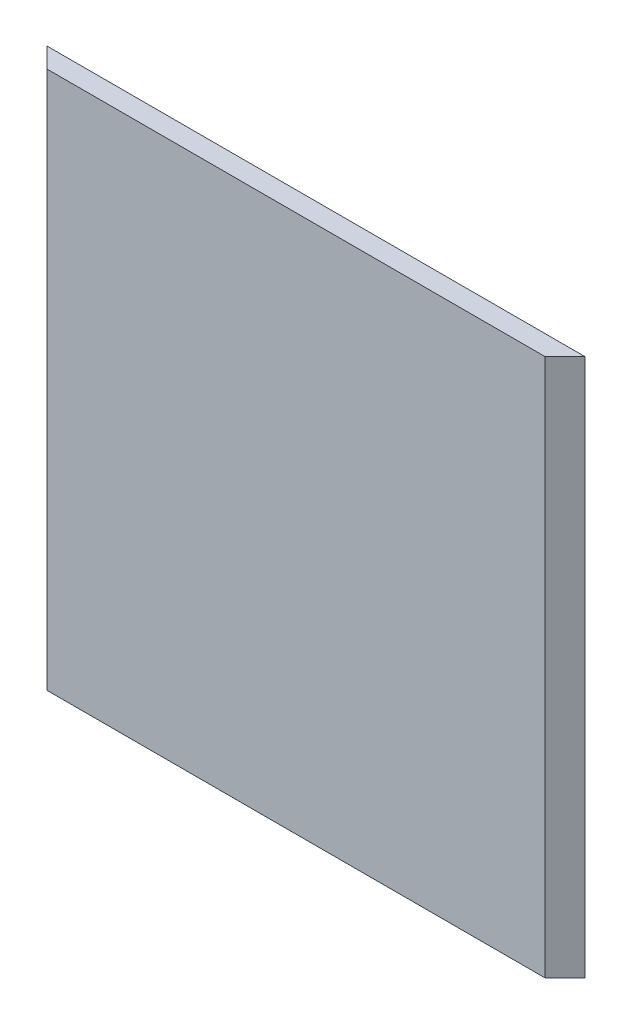
ISO-10303-21;
HEADER;
FILE_DESCRIPTION(('STEP AP214'),'2;1');
FILE_NAME('part.step','',(''),(''),'','','');
FILE_SCHEMA(('AUTOMOTIVE_DESIGN { 1 0 10303 214 1 1 1 1 }'));
ENDSEC;
DATA;
#1=APPLICATION_CONTEXT('core data for automotive mechanical design processes');
#2=APPLICATION_PROTOCOL_DEFINITION('international standard','automotive_design',2000,#1);
#3=PRODUCT_CONTEXT('',#1,'mechanical');
#4=PRODUCT('Part','Part','',(#3));
#5=PRODUCT_RELATED_PRODUCT_CATEGORY('part','',(#4));
#6=PRODUCT_DEFINITION_FORMATION('','',#4);
#7=PRODUCT_DEFINITION_CONTEXT('part definition',#1,'design');
#8=PRODUCT_DEFINITION('design','',#6,#7);
#9=PRODUCT_DEFINITION_SHAPE('','',#8);
#10=(LENGTH_UNIT() NAMED_UNIT(*) SI_UNIT(.MILLI.,.METRE.));
#11=(NAMED_UNIT(*) PLANE_ANGLE_UNIT() SI_UNIT($,.RADIAN.));
#12=(NAMED_UNIT(*) SI_UNIT($,.STERADIAN.) SOLID_ANGLE_UNIT());
#13=UNCERTAINTY_MEASURE_WITH_UNIT(LENGTH_MEASURE(1.E-05),#10,'distance_accuracy_value','');
#14=(GEOMETRIC_REPRESENTATION_CONTEXT(3) GLOBAL_UNCERTAINTY_ASSIGNED_CONTEXT((#13)) GLOBAL_UNIT_ASSIGNED_CONTEXT((#10,
#11,#12)) REPRESENTATION_CONTEXT('',''));
#15=CARTESIAN_POINT('',(0.,0.,0.));
#16=DIRECTION('',(0.,0.,1.));
#17=DIRECTION('',(1.,0.,0.));
#18=AXIS2_PLACEMENT_3D('',#15,#16,#17);
#19=CARTESIAN_POINT('',(62.50000122,59.0000006,1.));
#20=DIRECTION('',(0.,0.,1.));
#21=DIRECTION('',(1.,0.,0.));
#22=AXIS2_PLACEMENT_3D('',#19,#20,#21);
#23=PLANE('',#22);
#24=DIRECTION('',(1.,1.19248806385E-08,0.));
#25=VECTOR('',#24,1.);
#26=CARTESIAN_POINT('',(63.265788701307,58.325000609132,1.));
#27=LINE('',#26,#25);
#28=CARTESIAN_POINT('',(63.1250012240247,58.3250006037265,1.00000000402467));
#29=VERTEX_POINT('',#28);
#30=CARTESIAN_POINT('',(61.8750012240245,58.325000592249,1.00000000000002));
#31=VERTEX_POINT('',#30);
#32=EDGE_CURVE('E81',#29,#31,#27,.F.);
#33=ORIENTED_EDGE('',*,*,#32,.F.);
#34=DIRECTION('',(-5.96244031924794E-09,1.,-5.96244031924794E-09));
#35=VECTOR('',#34,1.);
#36=CARTESIAN_POINT('',(63.1250012191805,58.462500607751,1.0000000072295));
#37=LINE('',#36,#35);
#38=CARTESIAN_POINT('',(63.1250012159755,59.675000607602,1.00000000000001));
#39=VERTEX_POINT('',#38);
#40=EDGE_CURVE('E68',#39,#29,#37,.F.);
#41=ORIENTED_EDGE('',*,*,#40,.F.);
#42=DIRECTION('',(-1.,-1.19248806385E-08,0.));
#43=VECTOR('',#42,1.);
#44=CARTESIAN_POINT('',(61.734213738693,59.675000590868,1.));
#45=LINE('',#44,#43);
#46=CARTESIAN_POINT('',(61.8750012159753,59.6750005962735,1.00000000402467));
#47=VERTEX_POINT('',#46);
#48=EDGE_CURVE('E55',#47,#39,#45,.F.);
#49=ORIENTED_EDGE('',*,*,#48,.F.);
#50=DIRECTION('',(-5.96244031924794E-09,1.,5.96244031924794E-09));
#51=VECTOR('',#50,1.);
#52=CARTESIAN_POINT('',(61.8750012208195,59.537500592249,1.0000000072295));
#53=LINE('',#52,#51);
#54=EDGE_CURVE('E20',#31,#47,#53,.T.);
#55=ORIENTED_EDGE('',*,*,#54,.F.);
#56=EDGE_LOOP('',(#33,#41,#49,#55));
#57=FACE_BOUND('',#56,.T.);
#58=ADVANCED_FACE('F17',(#57),#23,.T.);
#59=CARTESIAN_POINT('',(61.85000121359,59.537500592249,0.975));
#60=DIRECTION('',(-0.707106781186548,-8.4321639643206E-09,0.707106781186548));
#61=DIRECTION('',(0.707106781186548,0.,0.707106781186548));
#62=AXIS2_PLACEMENT_3D('',#59,#60,#61);
#63=PLANE('',#62);
#64=DIRECTION('',(-0.707106781186557,-8.43218154936109E-09,-0.707106781186538));
#65=VECTOR('',#64,1.);
#66=CARTESIAN_POINT('',(61.875001228049,58.325000592547,1.));
#67=LINE('',#66,#65);
#68=CARTESIAN_POINT('',(61.8250012240245,58.3250005959754,0.949999995975519));
#69=VERTEX_POINT('',#68);
#70=EDGE_CURVE('E64',#31,#69,#67,.T.);
#71=ORIENTED_EDGE('',*,*,#70,.F.);
#72=ORIENTED_EDGE('',*,*,#54,.T.);
#73=DIRECTION('',(0.707106781186607,8.4321815493605E-09,0.707106781186488));
#74=VECTOR('',#73,1.);
#75=CARTESIAN_POINT('',(61.825001211951,59.6750005919506,0.95));
#76=LINE('',#75,#74);
#77=CARTESIAN_POINT('',(61.8250012159753,59.6750005922489,0.950000000000167));
#78=VERTEX_POINT('',#77);
#79=EDGE_CURVE('E61',#78,#47,#76,.T.);
#80=ORIENTED_EDGE('',*,*,#79,.F.);
#81=DIRECTION('',(0.,1.,0.));
#82=VECTOR('',#81,1.);
#83=CARTESIAN_POINT('',(61.825001228049,59.0000006,0.95));
#84=LINE('',#83,#82);
#85=EDGE_CURVE('E83',#69,#78,#84,.T.);
#86=ORIENTED_EDGE('',*,*,#85,.F.);
#87=EDGE_LOOP('',(#71,#72,#80,#86));
#88=FACE_BOUND('',#87,.T.);
#89=ADVANCED_FACE('F60',(#88),#63,.T.);
#90=CARTESIAN_POINT('',(61.734213738693,59.675000590868,1.));
#91=DIRECTION('',(-1.19248806385E-08,1.,0.));
#92=DIRECTION('',(-1.,-1.19248806385E-08,0.));
#93=AXIS2_PLACEMENT_3D('',#90,#91,#92);
#94=PLANE('',#93);
#95=DIRECTION('',(0.707106781186548,0.,-0.707106781186548));
#96=VECTOR('',#95,1.);
#97=CARTESIAN_POINT('',(63.1500012191805,59.675000608049,0.974999992770541));
#98=LINE('',#97,#96);
#99=CARTESIAN_POINT('',(63.1750012139633,59.6750006040246,0.94999999798776));
#100=VERTEX_POINT('',#99);
#101=EDGE_CURVE('E70',#100,#39,#98,.F.);
#102=ORIENTED_EDGE('',*,*,#101,.F.);
#103=DIRECTION('',(-1.,0.,0.));
#104=VECTOR('',#103,1.);
#105=CARTESIAN_POINT('',(62.50000122,59.675000591951,0.95));
#106=LINE('',#105,#104);
#107=EDGE_CURVE('E74',#78,#100,#106,.F.);
#108=ORIENTED_EDGE('',*,*,#107,.F.);
#109=ORIENTED_EDGE('',*,*,#79,.T.);
#110=ORIENTED_EDGE('',*,*,#48,.T.);
#111=EDGE_LOOP('',(#102,#108,#109,#110));
#112=FACE_BOUND('',#111,.T.);
#113=ADVANCED_FACE('F72',(#112),#94,.T.);
#114=CARTESIAN_POINT('',(63.15000122641,58.462500607751,0.975));
#115=DIRECTION('',(0.707106781186548,8.4321639643206E-09,0.707106781186548));
#116=DIRECTION('',(0.707106781186548,0.,-0.707106781186548));
#117=AXIS2_PLACEMENT_3D('',#114,#115,#116);
#118=PLANE('',#117);
#119=DIRECTION('',(-0.707106781186607,-8.4321815493605E-09,0.707106781186488));
#120=VECTOR('',#119,1.);
#121=CARTESIAN_POINT('',(63.175001228049,58.3250006080494,0.95));
#122=LINE('',#121,#120);
#123=CARTESIAN_POINT('',(63.1750012240247,58.3250006077511,0.950000000000165));
#124=VERTEX_POINT('',#123);
#125=EDGE_CURVE('E35',#124,#29,#122,.T.);
#126=ORIENTED_EDGE('',*,*,#125,.F.);
#127=DIRECTION('',(0.,1.,0.));
#128=VECTOR('',#127,1.);
#129=CARTESIAN_POINT('',(63.175001211951,59.0000006,0.95));
#130=LINE('',#129,#128);
#131=EDGE_CURVE('E26',#100,#124,#130,.F.);
#132=ORIENTED_EDGE('',*,*,#131,.F.);
#133=ORIENTED_EDGE('',*,*,#101,.T.);
#134=ORIENTED_EDGE('',*,*,#40,.T.);
#135=EDGE_LOOP('',(#126,#132,#133,#134));
#136=FACE_BOUND('',#135,.T.);
#137=ADVANCED_FACE('F89',(#136),#118,.T.);
#138=CARTESIAN_POINT('',(63.265788701307,58.325000609132,1.));
#139=DIRECTION('',(1.19248806385E-08,-1.,0.));
#140=DIRECTION('',(1.,1.19248806385E-08,0.));
#141=AXIS2_PLACEMENT_3D('',#138,#139,#140);
#142=PLANE('',#141);
#143=ORIENTED_EDGE('',*,*,#125,.T.);
#144=ORIENTED_EDGE('',*,*,#32,.T.);
#145=ORIENTED_EDGE('',*,*,#70,.T.);
#146=DIRECTION('',(-1.,0.,0.));
#147=VECTOR('',#146,1.);
#148=CARTESIAN_POINT('',(62.50000122,58.325000608049,0.95));
#149=LINE('',#148,#147);
#150=EDGE_CURVE('E11',#124,#69,#149,.T.);
#151=ORIENTED_EDGE('',*,*,#150,.F.);
#152=EDGE_LOOP('',(#143,#144,#145,#151));
#153=FACE_BOUND('',#152,.T.);
#154=ADVANCED_FACE('F91',(#153),#142,.T.);
#155=CARTESIAN_POINT('',(62.50000122,59.0000006,0.95));
#156=DIRECTION('',(0.,0.,-1.));
#157=DIRECTION('',(-1.,0.,0.));
#158=AXIS2_PLACEMENT_3D('',#155,#156,#157);
#159=PLANE('',#158);
#160=ORIENTED_EDGE('',*,*,#131,.T.);
#161=ORIENTED_EDGE('',*,*,#150,.T.);
#162=ORIENTED_EDGE('',*,*,#85,.T.);
#163=ORIENTED_EDGE('',*,*,#107,.T.);
#164=EDGE_LOOP('',(#160,#161,#162,#163));
#165=FACE_BOUND('',#164,.T.);
#166=ADVANCED_FACE('F88',(#165),#159,.T.);
#167=CLOSED_SHELL('',(#58,#89,#113,#137,#154,#166));
#168=MANIFOLD_SOLID_BREP('B1',#167);
#169=ADVANCED_BREP_SHAPE_REPRESENTATION('',(#18,#168),#14);
#170=SHAPE_DEFINITION_REPRESENTATION(#9,#169);
ENDSEC;
END-ISO-10303-21;
